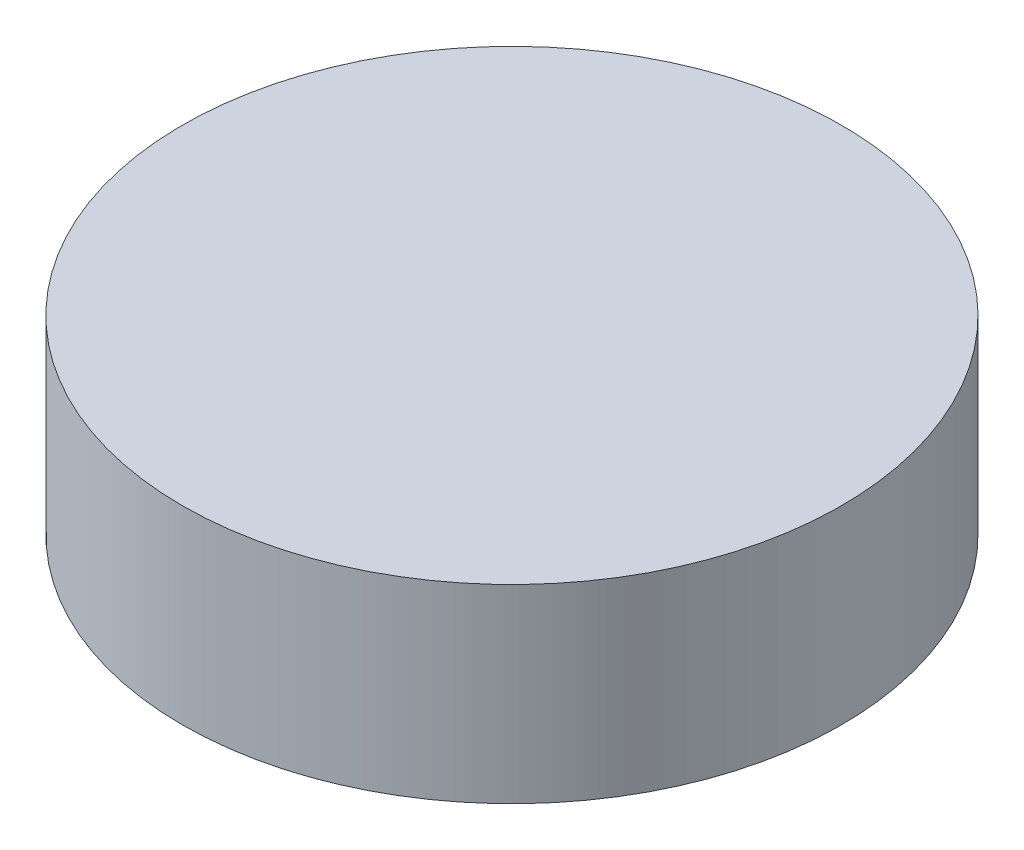
ISO-10303-21;
HEADER;
FILE_DESCRIPTION(('STEP AP214'),'2;1');
FILE_NAME('part.step','',(''),(''),'','','');
FILE_SCHEMA(('AUTOMOTIVE_DESIGN { 1 0 10303 214 1 1 1 1 }'));
ENDSEC;
DATA;
#1=APPLICATION_CONTEXT('core data for automotive mechanical design processes');
#2=APPLICATION_PROTOCOL_DEFINITION('international standard','automotive_design',2000,#1);
#3=PRODUCT_CONTEXT('',#1,'mechanical');
#4=PRODUCT('Part','Part','',(#3));
#5=PRODUCT_RELATED_PRODUCT_CATEGORY('part','',(#4));
#6=PRODUCT_DEFINITION_FORMATION('','',#4);
#7=PRODUCT_DEFINITION_CONTEXT('part definition',#1,'design');
#8=PRODUCT_DEFINITION('design','',#6,#7);
#9=PRODUCT_DEFINITION_SHAPE('','',#8);
#10=(LENGTH_UNIT() NAMED_UNIT(*) SI_UNIT(.MILLI.,.METRE.));
#11=(NAMED_UNIT(*) PLANE_ANGLE_UNIT() SI_UNIT($,.RADIAN.));
#12=(NAMED_UNIT(*) SI_UNIT($,.STERADIAN.) SOLID_ANGLE_UNIT());
#13=UNCERTAINTY_MEASURE_WITH_UNIT(LENGTH_MEASURE(1.E-05),#10,'distance_accuracy_value','');
#14=(GEOMETRIC_REPRESENTATION_CONTEXT(3) GLOBAL_UNCERTAINTY_ASSIGNED_CONTEXT((#13)) GLOBAL_UNIT_ASSIGNED_CONTEXT((#10,
#11,#12)) REPRESENTATION_CONTEXT('',''));
#15=CARTESIAN_POINT('',(0.,0.,0.));
#16=DIRECTION('',(0.,0.,1.));
#17=DIRECTION('',(1.,0.,0.));
#18=AXIS2_PLACEMENT_3D('',#15,#16,#17);
#19=CARTESIAN_POINT('',(0.,4.572,0.));
#20=DIRECTION('',(0.,-1.,0.));
#21=DIRECTION('',(0.,0.,-1.));
#22=AXIS2_PLACEMENT_3D('',#19,#20,#21);
#23=CYLINDRICAL_SURFACE('',#22,7.9375);
#24=CARTESIAN_POINT('',(0.,4.572,0.));
#25=DIRECTION('',(0.,1.,0.));
#26=DIRECTION('',(0.,0.,1.));
#27=AXIS2_PLACEMENT_3D('',#24,#25,#26);
#28=CIRCLE('',#27,7.9375);
#29=CARTESIAN_POINT('',(0.,4.572,7.9375));
#30=VERTEX_POINT('',#29);
#31=EDGE_CURVE('E10',#30,#30,#28,.T.);
#32=ORIENTED_EDGE('',*,*,#31,.F.);
#33=EDGE_LOOP('',(#32));
#34=FACE_BOUND('',#33,.T.);
#35=CARTESIAN_POINT('',(0.,0.,0.));
#36=DIRECTION('',(0.,1.,0.));
#37=DIRECTION('',(0.,0.,1.));
#38=AXIS2_PLACEMENT_3D('',#35,#36,#37);
#39=CIRCLE('',#38,7.9375);
#40=CARTESIAN_POINT('',(0.,0.,7.9375));
#41=VERTEX_POINT('',#40);
#42=EDGE_CURVE('E34',#41,#41,#39,.T.);
#43=ORIENTED_EDGE('',*,*,#42,.T.);
#44=EDGE_LOOP('',(#43));
#45=FACE_BOUND('',#44,.T.);
#46=ADVANCED_FACE('F31',(#34,#45),#23,.T.);
#47=CARTESIAN_POINT('',(0.,4.572,0.));
#48=DIRECTION('',(0.,1.,0.));
#49=DIRECTION('',(0.,0.,1.));
#50=AXIS2_PLACEMENT_3D('',#47,#48,#49);
#51=PLANE('',#50);
#52=ORIENTED_EDGE('',*,*,#31,.T.);
#53=EDGE_LOOP('',(#52));
#54=FACE_BOUND('',#53,.T.);
#55=ADVANCED_FACE('F46',(#54),#51,.T.);
#56=CARTESIAN_POINT('',(0.,0.,0.));
#57=DIRECTION('',(0.,1.,0.));
#58=DIRECTION('',(0.,0.,1.));
#59=AXIS2_PLACEMENT_3D('',#56,#57,#58);
#60=PLANE('',#59);
#61=ORIENTED_EDGE('',*,*,#42,.F.);
#62=EDGE_LOOP('',(#61));
#63=FACE_BOUND('',#62,.T.);
#64=ADVANCED_FACE('F44',(#63),#60,.F.);
#65=CLOSED_SHELL('',(#46,#55,#64));
#66=MANIFOLD_SOLID_BREP('B2',#65);
#67=ADVANCED_BREP_SHAPE_REPRESENTATION('',(#18,#66),#14);
#68=SHAPE_DEFINITION_REPRESENTATION(#9,#67);
ENDSEC;
END-ISO-10303-21;
